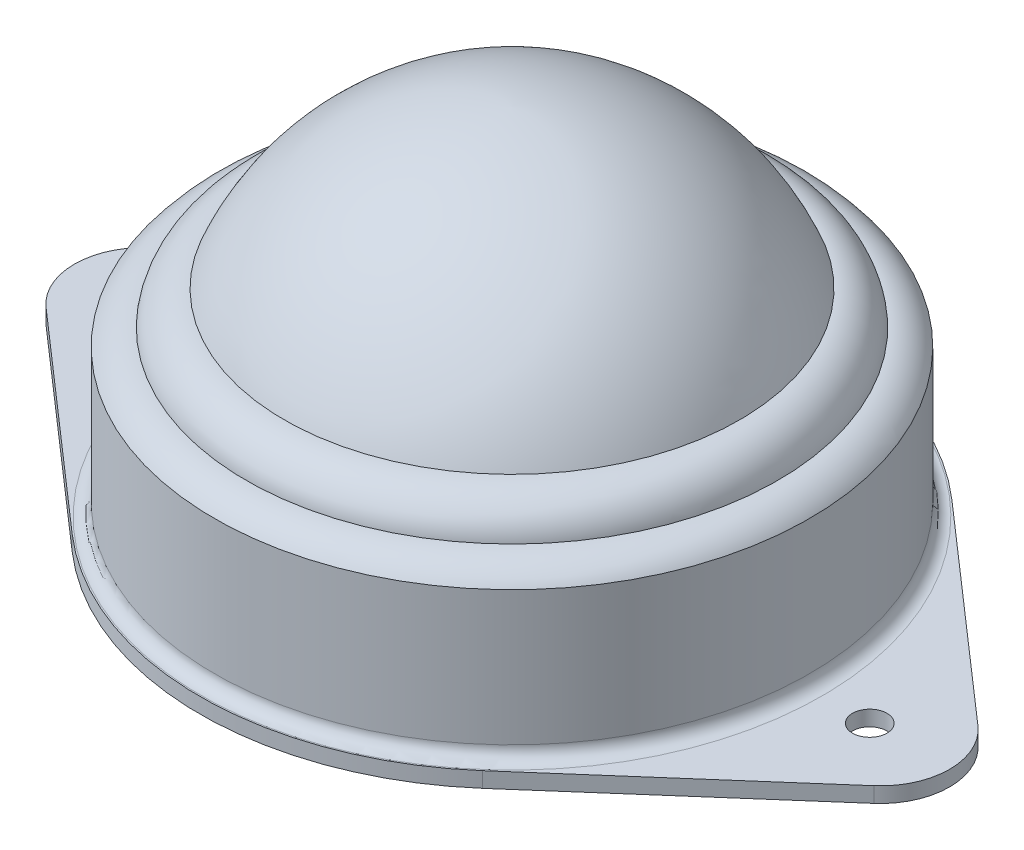
ISO-10303-21;
HEADER;
FILE_DESCRIPTION(('STEP AP214'),'2;1');
FILE_NAME('part.step','',(''),(''),'','','');
FILE_SCHEMA(('AUTOMOTIVE_DESIGN { 1 0 10303 214 1 1 1 1 }'));
ENDSEC;
DATA;
#1=APPLICATION_CONTEXT('core data for automotive mechanical design processes');
#2=APPLICATION_PROTOCOL_DEFINITION('international standard','automotive_design',2000,#1);
#3=PRODUCT_CONTEXT('',#1,'mechanical');
#4=PRODUCT('Part','Part','',(#3));
#5=PRODUCT_RELATED_PRODUCT_CATEGORY('part','',(#4));
#6=PRODUCT_DEFINITION_FORMATION('','',#4);
#7=PRODUCT_DEFINITION_CONTEXT('part definition',#1,'design');
#8=PRODUCT_DEFINITION('design','',#6,#7);
#9=PRODUCT_DEFINITION_SHAPE('','',#8);
#10=(LENGTH_UNIT() NAMED_UNIT(*) SI_UNIT(.MILLI.,.METRE.));
#11=(NAMED_UNIT(*) PLANE_ANGLE_UNIT() SI_UNIT($,.RADIAN.));
#12=(NAMED_UNIT(*) SI_UNIT($,.STERADIAN.) SOLID_ANGLE_UNIT());
#13=UNCERTAINTY_MEASURE_WITH_UNIT(LENGTH_MEASURE(1.E-05),#10,'distance_accuracy_value','');
#14=(GEOMETRIC_REPRESENTATION_CONTEXT(3) GLOBAL_UNCERTAINTY_ASSIGNED_CONTEXT((#13)) GLOBAL_UNIT_ASSIGNED_CONTEXT((#10,
#11,#12)) REPRESENTATION_CONTEXT('',''));
#15=CARTESIAN_POINT('',(0.,0.,0.));
#16=DIRECTION('',(0.,0.,1.));
#17=DIRECTION('',(1.,0.,0.));
#18=AXIS2_PLACEMENT_3D('',#15,#16,#17);
#19=CARTESIAN_POINT('',(0.,0.,0.));
#20=DIRECTION('',(0.,-1.,0.));
#21=DIRECTION('',(0.,0.,-1.));
#22=AXIS2_PLACEMENT_3D('',#19,#20,#21);
#23=CYLINDRICAL_SURFACE('',#22,23.2910581343404);
#24=CARTESIAN_POINT('',(0.,1.,0.));
#25=DIRECTION('',(0.,-1.,0.));
#26=DIRECTION('',(0.,0.,-1.));
#27=AXIS2_PLACEMENT_3D('',#24,#25,#26);
#28=CIRCLE('',#27,23.2910581343404);
#29=CARTESIAN_POINT('',(0.,1.,-23.2910581343404));
#30=VERTEX_POINT('',#29);
#31=EDGE_CURVE('E11',#30,#30,#28,.F.);
#32=ORIENTED_EDGE('',*,*,#31,.T.);
#33=EDGE_LOOP('',(#32));
#34=FACE_BOUND('',#33,.T.);
#35=CARTESIAN_POINT('',(0.,11.5188668124026,0.));
#36=DIRECTION('',(0.,-1.,0.));
#37=DIRECTION('',(0.,0.,-1.));
#38=AXIS2_PLACEMENT_3D('',#35,#36,#37);
#39=CIRCLE('',#38,23.2910581343404);
#40=CARTESIAN_POINT('',(0.,11.5188668124026,-23.2910581343404));
#41=VERTEX_POINT('',#40);
#42=EDGE_CURVE('E173',#41,#41,#39,.T.);
#43=ORIENTED_EDGE('',*,*,#42,.T.);
#44=EDGE_LOOP('',(#43));
#45=FACE_BOUND('',#44,.T.);
#46=ADVANCED_FACE('F35',(#34,#45),#23,.T.);
#47=CARTESIAN_POINT('',(0.,9.8502327456351,0.));
#48=DIRECTION('',(0.,-1.,0.));
#49=DIRECTION('',(0.,0.,-1.));
#50=AXIS2_PLACEMENT_3D('',#47,#48,#49);
#51=TOROIDAL_SURFACE('',#50,20.7979355237928,3.00000000000011);
#52=CARTESIAN_POINT('',(0.,12.8502327455635,0.));
#53=DIRECTION('',(0.,-1.,0.));
#54=DIRECTION('',(0.,0.,-1.));
#55=AXIS2_PLACEMENT_3D('',#52,#53,#54);
#56=CIRCLE('',#55,20.7979147825503);
#57=CARTESIAN_POINT('',(0.,12.8502327455635,-20.7979147825503));
#58=VERTEX_POINT('',#57);
#59=EDGE_CURVE('E170',#58,#58,#56,.T.);
#60=ORIENTED_EDGE('',*,*,#59,.T.);
#61=EDGE_LOOP('',(#60));
#62=FACE_BOUND('',#61,.T.);
#63=ORIENTED_EDGE('',*,*,#42,.F.);
#64=EDGE_LOOP('',(#63));
#65=FACE_BOUND('',#64,.T.);
#66=ADVANCED_FACE('F192',(#62,#65),#51,.T.);
#67=CARTESIAN_POINT('',(0.,12.4686936550449,0.));
#68=DIRECTION('',(0.,-1.,0.));
#69=DIRECTION('',(0.,0.,-1.));
#70=AXIS2_PLACEMENT_3D('',#67,#68,#69);
#71=TOROIDAL_SURFACE('',#70,17.8222757045694,3.0000000000001);
#72=CARTESIAN_POINT('',(0.,15.4686936510302,0.));
#73=DIRECTION('',(0.,-1.,0.));
#74=DIRECTION('',(0.,0.,-1.));
#75=AXIS2_PLACEMENT_3D('',#72,#73,#74);
#76=CIRCLE('',#75,17.8221204992835);
#77=CARTESIAN_POINT('',(0.,15.4686936510302,-17.8221204992835));
#78=VERTEX_POINT('',#77);
#79=EDGE_CURVE('E167',#78,#78,#76,.T.);
#80=ORIENTED_EDGE('',*,*,#79,.T.);
#81=EDGE_LOOP('',(#80));
#82=FACE_BOUND('',#81,.T.);
#83=ORIENTED_EDGE('',*,*,#59,.F.);
#84=EDGE_LOOP('',(#83));
#85=FACE_BOUND('',#84,.T.);
#86=ADVANCED_FACE('F197',(#82,#85),#71,.T.);
#87=CARTESIAN_POINT('',(0.,7.93752103420176,0.56591275410103));
#88=DIRECTION('',(-1.,0.,0.));
#89=DIRECTION('',(0.,0.,-1.));
#90=AXIS2_PLACEMENT_3D('',#87,#88,#89);
#91=CIRCLE('',#90,19.8705391953022);
#92=TRIMMED_CURVE('',#91,(PARAMETER_VALUE(-1.5423124854973)),(PARAMETER_VALUE(1.5423124854973)),
.T.,.PARAMETER.);
#93=CARTESIAN_POINT('',(0.,7.93752103420176,0.));
#94=DIRECTION('',(0.,-1.,0.));
#95=AXIS1_PLACEMENT('',#93,#94);
#96=SURFACE_OF_REVOLUTION('',#92,#95);
#97=CARTESIAN_POINT('',(0.,27.8000000000003,0.));
#98=VERTEX_POINT('',#97);
#99=VERTEX_LOOP('',#98);
#100=FACE_BOUND('',#99,.T.);
#101=ORIENTED_EDGE('',*,*,#79,.F.);
#102=EDGE_LOOP('',(#101));
#103=FACE_BOUND('',#102,.T.);
#104=ADVANCED_FACE('F204',(#100,#103),#96,.T.);
#105=CARTESIAN_POINT('',(0.,-1.2,0.));
#106=DIRECTION('',(0.,1.,0.));
#107=DIRECTION('',(0.,0.,1.));
#108=AXIS2_PLACEMENT_3D('',#105,#106,#107);
#109=CYLINDRICAL_SURFACE('',#108,24.4);
#110=CARTESIAN_POINT('',(0.,0.,0.));
#111=DIRECTION('',(0.,-1.,0.));
#112=DIRECTION('',(0.,0.,-1.));
#113=AXIS2_PLACEMENT_3D('',#110,#111,#112);
#114=CIRCLE('',#113,24.4);
#115=CARTESIAN_POINT('',(16.0693240901213,0.,18.3612859921806));
#116=VERTEX_POINT('',#115);
#117=CARTESIAN_POINT('',(-16.0693240901213,0.,18.3612859921806));
#118=VERTEX_POINT('',#117);
#119=EDGE_CURVE('E136',#116,#118,#114,.T.);
#120=ORIENTED_EDGE('',*,*,#119,.T.);
#121=DIRECTION('',(0.,1.,0.));
#122=VECTOR('',#121,1.);
#123=CARTESIAN_POINT('',(-16.0693240901213,-1.2,18.3612859921806));
#124=LINE('',#123,#122);
#125=CARTESIAN_POINT('',(-16.0693240901213,-1.2,18.3612859921806));
#126=VERTEX_POINT('',#125);
#127=EDGE_CURVE('E165',#126,#118,#124,.T.);
#128=ORIENTED_EDGE('',*,*,#127,.F.);
#129=CARTESIAN_POINT('',(0.,-1.2,0.));
#130=DIRECTION('',(0.,-1.,0.));
#131=DIRECTION('',(0.,0.,-1.));
#132=AXIS2_PLACEMENT_3D('',#129,#130,#131);
#133=CIRCLE('',#132,24.4);
#134=CARTESIAN_POINT('',(16.0693240901213,-1.2,18.3612859921806));
#135=VERTEX_POINT('',#134);
#136=EDGE_CURVE('E152',#135,#126,#133,.T.);
#137=ORIENTED_EDGE('',*,*,#136,.F.);
#138=DIRECTION('',(0.,1.,0.));
#139=VECTOR('',#138,1.);
#140=CARTESIAN_POINT('',(16.0693240901213,-1.2,18.3612859921806));
#141=LINE('',#140,#139);
#142=EDGE_CURVE('E132',#135,#116,#141,.T.);
#143=ORIENTED_EDGE('',*,*,#142,.T.);
#144=EDGE_LOOP('',(#120,#128,#137,#143));
#145=FACE_BOUND('',#144,.T.);
#146=ADVANCED_FACE('F208',(#145),#109,.T.);
#147=CARTESIAN_POINT('',(-16.0693240901213,-1.2,18.3612859921806));
#148=DIRECTION('',(0.658578856152513,0.,-0.752511720991007));
#149=DIRECTION('',(-0.752511720991007,0.,-0.658578856152513));
#150=AXIS2_PLACEMENT_3D('',#147,#148,#149);
#151=PLANE('',#150);
#152=DIRECTION('',(-0.752511720991007,0.,-0.658578856152513));
#153=VECTOR('',#152,1.);
#154=CARTESIAN_POINT('',(-16.0693240901213,0.,18.3612859921806));
#155=LINE('',#154,#153);
#156=CARTESIAN_POINT('',(-32.4063258232236,0.,4.06356329335144));
#157=VERTEX_POINT('',#156);
#158=EDGE_CURVE('E139',#118,#157,#155,.T.);
#159=ORIENTED_EDGE('',*,*,#158,.T.);
#160=DIRECTION('',(0.,1.,0.));
#161=VECTOR('',#160,1.);
#162=CARTESIAN_POINT('',(-32.4063258232236,-1.2,4.06356329335144));
#163=LINE('',#162,#161);
#164=CARTESIAN_POINT('',(-32.4063258232236,-1.2,4.06356329335144));
#165=VERTEX_POINT('',#164);
#166=EDGE_CURVE('E162',#165,#157,#163,.T.);
#167=ORIENTED_EDGE('',*,*,#166,.F.);
#168=DIRECTION('',(-0.752511720991007,0.,-0.658578856152513));
#169=VECTOR('',#168,1.);
#170=CARTESIAN_POINT('',(-16.0693240901213,-1.2,18.3612859921806));
#171=LINE('',#170,#169);
#172=EDGE_CURVE('E95',#126,#165,#171,.T.);
#173=ORIENTED_EDGE('',*,*,#172,.F.);
#174=ORIENTED_EDGE('',*,*,#127,.T.);
#175=EDGE_LOOP('',(#159,#167,#173,#174));
#176=FACE_BOUND('',#175,.T.);
#177=ADVANCED_FACE('F211',(#176),#151,.F.);
#178=CARTESIAN_POINT('',(-28.85,-1.2,0.));
#179=DIRECTION('',(0.,1.,0.));
#180=DIRECTION('',(0.,0.,1.));
#181=AXIS2_PLACEMENT_3D('',#178,#179,#180);
#182=CYLINDRICAL_SURFACE('',#181,5.4);
#183=CARTESIAN_POINT('',(-28.85,0.,0.));
#184=DIRECTION('',(0.,-1.,0.));
#185=DIRECTION('',(0.,0.,1.));
#186=AXIS2_PLACEMENT_3D('',#183,#184,#185);
#187=CIRCLE('',#186,5.4);
#188=CARTESIAN_POINT('',(-32.4063258232236,0.,-4.06356329335144));
#189=VERTEX_POINT('',#188);
#190=EDGE_CURVE('E142',#157,#189,#187,.T.);
#191=ORIENTED_EDGE('',*,*,#190,.T.);
#192=DIRECTION('',(0.,1.,0.));
#193=VECTOR('',#192,1.);
#194=CARTESIAN_POINT('',(-32.4063258232236,-1.2,-4.06356329335144));
#195=LINE('',#194,#193);
#196=CARTESIAN_POINT('',(-32.4063258232236,-1.2,-4.06356329335144));
#197=VERTEX_POINT('',#196);
#198=EDGE_CURVE('E159',#197,#189,#195,.T.);
#199=ORIENTED_EDGE('',*,*,#198,.F.);
#200=CARTESIAN_POINT('',(-28.85,-1.2,0.));
#201=DIRECTION('',(0.,-1.,0.));
#202=DIRECTION('',(0.,0.,1.));
#203=AXIS2_PLACEMENT_3D('',#200,#201,#202);
#204=CIRCLE('',#203,5.4);
#205=EDGE_CURVE('E260',#165,#197,#204,.T.);
#206=ORIENTED_EDGE('',*,*,#205,.F.);
#207=ORIENTED_EDGE('',*,*,#166,.T.);
#208=EDGE_LOOP('',(#191,#199,#206,#207));
#209=FACE_BOUND('',#208,.T.);
#210=ADVANCED_FACE('F215',(#209),#182,.T.);
#211=CARTESIAN_POINT('',(-16.0693240901213,-1.2,-18.3612859921806));
#212=DIRECTION('',(0.658578856152513,0.,0.752511720991007));
#213=DIRECTION('',(0.752511720991007,0.,-0.658578856152513));
#214=AXIS2_PLACEMENT_3D('',#211,#212,#213);
#215=PLANE('',#214);
#216=DIRECTION('',(0.752511720991007,0.,-0.658578856152513));
#217=VECTOR('',#216,1.);
#218=CARTESIAN_POINT('',(-16.0693240901213,0.,-18.3612859921806));
#219=LINE('',#218,#217);
#220=CARTESIAN_POINT('',(-16.0693240901213,0.,-18.3612859921806));
#221=VERTEX_POINT('',#220);
#222=EDGE_CURVE('E144',#189,#221,#219,.T.);
#223=ORIENTED_EDGE('',*,*,#222,.T.);
#224=DIRECTION('',(0.,1.,0.));
#225=VECTOR('',#224,1.);
#226=CARTESIAN_POINT('',(-16.0693240901213,-1.2,-18.3612859921806));
#227=LINE('',#226,#225);
#228=CARTESIAN_POINT('',(-16.0693240901213,-1.2,-18.3612859921806));
#229=VERTEX_POINT('',#228);
#230=EDGE_CURVE('E156',#229,#221,#227,.T.);
#231=ORIENTED_EDGE('',*,*,#230,.F.);
#232=DIRECTION('',(0.752511720991007,0.,-0.658578856152513));
#233=VECTOR('',#232,1.);
#234=CARTESIAN_POINT('',(-16.0693240901213,-1.2,-18.3612859921806));
#235=LINE('',#234,#233);
#236=EDGE_CURVE('E262',#197,#229,#235,.T.);
#237=ORIENTED_EDGE('',*,*,#236,.F.);
#238=ORIENTED_EDGE('',*,*,#198,.T.);
#239=EDGE_LOOP('',(#223,#231,#237,#238));
#240=FACE_BOUND('',#239,.T.);
#241=ADVANCED_FACE('F218',(#240),#215,.F.);
#242=CARTESIAN_POINT('',(0.,-1.2,0.));
#243=DIRECTION('',(0.,1.,0.));
#244=DIRECTION('',(0.,0.,1.));
#245=AXIS2_PLACEMENT_3D('',#242,#243,#244);
#246=CYLINDRICAL_SURFACE('',#245,24.4);
#247=CARTESIAN_POINT('',(0.,0.,0.));
#248=DIRECTION('',(0.,-1.,0.));
#249=DIRECTION('',(0.,0.,-1.));
#250=AXIS2_PLACEMENT_3D('',#247,#248,#249);
#251=CIRCLE('',#250,24.4);
#252=CARTESIAN_POINT('',(16.0693240901213,0.,-18.3612859921806));
#253=VERTEX_POINT('',#252);
#254=EDGE_CURVE('E146',#221,#253,#251,.T.);
#255=ORIENTED_EDGE('',*,*,#254,.T.);
#256=DIRECTION('',(0.,1.,0.));
#257=VECTOR('',#256,1.);
#258=CARTESIAN_POINT('',(16.0693240901213,-1.2,-18.3612859921806));
#259=LINE('',#258,#257);
#260=CARTESIAN_POINT('',(16.0693240901213,-1.2,-18.3612859921806));
#261=VERTEX_POINT('',#260);
#262=EDGE_CURVE('E127',#261,#253,#259,.T.);
#263=ORIENTED_EDGE('',*,*,#262,.F.);
#264=CARTESIAN_POINT('',(0.,-1.2,0.));
#265=DIRECTION('',(0.,-1.,0.));
#266=DIRECTION('',(0.,0.,-1.));
#267=AXIS2_PLACEMENT_3D('',#264,#265,#266);
#268=CIRCLE('',#267,24.4);
#269=EDGE_CURVE('E115',#229,#261,#268,.T.);
#270=ORIENTED_EDGE('',*,*,#269,.F.);
#271=ORIENTED_EDGE('',*,*,#230,.T.);
#272=EDGE_LOOP('',(#255,#263,#270,#271));
#273=FACE_BOUND('',#272,.T.);
#274=ADVANCED_FACE('F222',(#273),#246,.T.);
#275=CARTESIAN_POINT('',(16.0693240901213,-1.2,-18.3612859921806));
#276=DIRECTION('',(-0.658578856152513,0.,0.752511720991007));
#277=DIRECTION('',(0.752511720991007,0.,0.658578856152513));
#278=AXIS2_PLACEMENT_3D('',#275,#276,#277);
#279=PLANE('',#278);
#280=DIRECTION('',(0.752511720991007,0.,0.658578856152513));
#281=VECTOR('',#280,1.);
#282=CARTESIAN_POINT('',(16.0693240901213,0.,-18.3612859921806));
#283=LINE('',#282,#281);
#284=CARTESIAN_POINT('',(32.4063258232236,0.,-4.06356329335144));
#285=VERTEX_POINT('',#284);
#286=EDGE_CURVE('E124',#253,#285,#283,.T.);
#287=ORIENTED_EDGE('',*,*,#286,.T.);
#288=DIRECTION('',(0.,1.,0.));
#289=VECTOR('',#288,1.);
#290=CARTESIAN_POINT('',(32.4063258232236,-1.2,-4.06356329335144));
#291=LINE('',#290,#289);
#292=CARTESIAN_POINT('',(32.4063258232236,-1.2,-4.06356329335144));
#293=VERTEX_POINT('',#292);
#294=EDGE_CURVE('E121',#293,#285,#291,.T.);
#295=ORIENTED_EDGE('',*,*,#294,.F.);
#296=DIRECTION('',(0.752511720991007,0.,0.658578856152513));
#297=VECTOR('',#296,1.);
#298=CARTESIAN_POINT('',(16.0693240901213,-1.2,-18.3612859921806));
#299=LINE('',#298,#297);
#300=EDGE_CURVE('E108',#261,#293,#299,.T.);
#301=ORIENTED_EDGE('',*,*,#300,.F.);
#302=ORIENTED_EDGE('',*,*,#262,.T.);
#303=EDGE_LOOP('',(#287,#295,#301,#302));
#304=FACE_BOUND('',#303,.T.);
#305=ADVANCED_FACE('F122',(#304),#279,.F.);
#306=CARTESIAN_POINT('',(28.85,-1.2,0.));
#307=DIRECTION('',(0.,1.,0.));
#308=DIRECTION('',(0.,0.,1.));
#309=AXIS2_PLACEMENT_3D('',#306,#307,#308);
#310=CYLINDRICAL_SURFACE('',#309,5.4);
#311=CARTESIAN_POINT('',(28.85,0.,0.));
#312=DIRECTION('',(0.,-1.,0.));
#313=DIRECTION('',(0.,0.,-1.));
#314=AXIS2_PLACEMENT_3D('',#311,#312,#313);
#315=CIRCLE('',#314,5.4);
#316=CARTESIAN_POINT('',(32.4063258232236,0.,4.06356329335144));
#317=VERTEX_POINT('',#316);
#318=EDGE_CURVE('E149',#285,#317,#315,.T.);
#319=ORIENTED_EDGE('',*,*,#318,.T.);
#320=DIRECTION('',(0.,1.,0.));
#321=VECTOR('',#320,1.);
#322=CARTESIAN_POINT('',(32.4063258232236,-1.2,4.06356329335144));
#323=LINE('',#322,#321);
#324=CARTESIAN_POINT('',(32.4063258232236,-1.2,4.06356329335144));
#325=VERTEX_POINT('',#324);
#326=EDGE_CURVE('E128',#325,#317,#323,.T.);
#327=ORIENTED_EDGE('',*,*,#326,.F.);
#328=CARTESIAN_POINT('',(28.85,-1.2,0.));
#329=DIRECTION('',(0.,-1.,0.));
#330=DIRECTION('',(0.,0.,-1.));
#331=AXIS2_PLACEMENT_3D('',#328,#329,#330);
#332=CIRCLE('',#331,5.4);
#333=EDGE_CURVE('E112',#293,#325,#332,.T.);
#334=ORIENTED_EDGE('',*,*,#333,.F.);
#335=ORIENTED_EDGE('',*,*,#294,.T.);
#336=EDGE_LOOP('',(#319,#327,#334,#335));
#337=FACE_BOUND('',#336,.T.);
#338=ADVANCED_FACE('F130',(#337),#310,.T.);
#339=CARTESIAN_POINT('',(16.0693240901213,-1.2,18.3612859921806));
#340=DIRECTION('',(-0.658578856152513,0.,-0.752511720991007));
#341=DIRECTION('',(-0.752511720991007,0.,0.658578856152513));
#342=AXIS2_PLACEMENT_3D('',#339,#340,#341);
#343=PLANE('',#342);
#344=DIRECTION('',(-0.752511720991007,0.,0.658578856152513));
#345=VECTOR('',#344,1.);
#346=CARTESIAN_POINT('',(16.0693240901213,0.,18.3612859921806));
#347=LINE('',#346,#345);
#348=EDGE_CURVE('E86',#317,#116,#347,.T.);
#349=ORIENTED_EDGE('',*,*,#348,.T.);
#350=ORIENTED_EDGE('',*,*,#142,.F.);
#351=DIRECTION('',(-0.752511720991007,0.,0.658578856152513));
#352=VECTOR('',#351,1.);
#353=CARTESIAN_POINT('',(16.0693240901213,-1.2,18.3612859921806));
#354=LINE('',#353,#352);
#355=EDGE_CURVE('E54',#325,#135,#354,.T.);
#356=ORIENTED_EDGE('',*,*,#355,.F.);
#357=ORIENTED_EDGE('',*,*,#326,.T.);
#358=EDGE_LOOP('',(#349,#350,#356,#357));
#359=FACE_BOUND('',#358,.T.);
#360=ADVANCED_FACE('F231',(#359),#343,.F.);
#361=CARTESIAN_POINT('',(0.,-1.2,0.));
#362=DIRECTION('',(0.,-1.,0.));
#363=DIRECTION('',(0.,0.,-1.));
#364=AXIS2_PLACEMENT_3D('',#361,#362,#363);
#365=PLANE('',#364);
#366=CARTESIAN_POINT('',(28.,-1.2,0.));
#367=DIRECTION('',(0.,1.,0.));
#368=DIRECTION('',(0.,0.,-1.));
#369=AXIS2_PLACEMENT_3D('',#366,#367,#368);
#370=CIRCLE('',#369,1.35);
#371=CARTESIAN_POINT('',(28.,-1.2,-1.35));
#372=VERTEX_POINT('',#371);
#373=EDGE_CURVE('E250',#372,#372,#370,.T.);
#374=ORIENTED_EDGE('',*,*,#373,.T.);
#375=EDGE_LOOP('',(#374));
#376=FACE_BOUND('',#375,.T.);
#377=CARTESIAN_POINT('',(-28.,-1.2,0.));
#378=DIRECTION('',(0.,1.,0.));
#379=DIRECTION('',(0.,0.,1.));
#380=AXIS2_PLACEMENT_3D('',#377,#378,#379);
#381=CIRCLE('',#380,1.35);
#382=CARTESIAN_POINT('',(-28.,-1.2,1.35));
#383=VERTEX_POINT('',#382);
#384=EDGE_CURVE('E140',#383,#383,#381,.T.);
#385=ORIENTED_EDGE('',*,*,#384,.T.);
#386=EDGE_LOOP('',(#385));
#387=FACE_BOUND('',#386,.T.);
#388=ORIENTED_EDGE('',*,*,#136,.T.);
#389=ORIENTED_EDGE('',*,*,#172,.T.);
#390=ORIENTED_EDGE('',*,*,#205,.T.);
#391=ORIENTED_EDGE('',*,*,#236,.T.);
#392=ORIENTED_EDGE('',*,*,#269,.T.);
#393=ORIENTED_EDGE('',*,*,#300,.T.);
#394=ORIENTED_EDGE('',*,*,#333,.T.);
#395=ORIENTED_EDGE('',*,*,#355,.T.);
#396=EDGE_LOOP('',(#388,#389,#390,#391,#392,#393,#394,#395));
#397=FACE_BOUND('',#396,.T.);
#398=ADVANCED_FACE('F110',(#376,#387,#397),#365,.T.);
#399=CARTESIAN_POINT('',(0.,0.,0.));
#400=DIRECTION('',(0.,-1.,0.));
#401=DIRECTION('',(0.,0.,-1.));
#402=AXIS2_PLACEMENT_3D('',#399,#400,#401);
#403=PLANE('',#402);
#404=CARTESIAN_POINT('',(0.,0.,0.));
#405=DIRECTION('',(0.,-1.,0.));
#406=DIRECTION('',(0.,0.,-1.));
#407=AXIS2_PLACEMENT_3D('',#404,#405,#406);
#408=CIRCLE('',#407,24.2910581343404);
#409=CARTESIAN_POINT('',(0.,0.,-24.2910581343404));
#410=VERTEX_POINT('',#409);
#411=EDGE_CURVE('E43',#410,#410,#408,.T.);
#412=ORIENTED_EDGE('',*,*,#411,.T.);
#413=EDGE_LOOP('',(#412));
#414=FACE_BOUND('',#413,.T.);
#415=CARTESIAN_POINT('',(28.,0.,0.));
#416=DIRECTION('',(0.,1.,0.));
#417=DIRECTION('',(0.,0.,-1.));
#418=AXIS2_PLACEMENT_3D('',#415,#416,#417);
#419=CIRCLE('',#418,1.35);
#420=CARTESIAN_POINT('',(28.,0.,-1.35));
#421=VERTEX_POINT('',#420);
#422=EDGE_CURVE('E254',#421,#421,#419,.T.);
#423=ORIENTED_EDGE('',*,*,#422,.F.);
#424=EDGE_LOOP('',(#423));
#425=FACE_BOUND('',#424,.T.);
#426=CARTESIAN_POINT('',(-28.,0.,0.));
#427=DIRECTION('',(0.,1.,0.));
#428=DIRECTION('',(0.,0.,1.));
#429=AXIS2_PLACEMENT_3D('',#426,#427,#428);
#430=CIRCLE('',#429,1.35);
#431=CARTESIAN_POINT('',(-28.,0.,1.35));
#432=VERTEX_POINT('',#431);
#433=EDGE_CURVE('E248',#432,#432,#430,.T.);
#434=ORIENTED_EDGE('',*,*,#433,.F.);
#435=EDGE_LOOP('',(#434));
#436=FACE_BOUND('',#435,.T.);
#437=ORIENTED_EDGE('',*,*,#119,.F.);
#438=ORIENTED_EDGE('',*,*,#348,.F.);
#439=ORIENTED_EDGE('',*,*,#318,.F.);
#440=ORIENTED_EDGE('',*,*,#286,.F.);
#441=ORIENTED_EDGE('',*,*,#254,.F.);
#442=ORIENTED_EDGE('',*,*,#222,.F.);
#443=ORIENTED_EDGE('',*,*,#190,.F.);
#444=ORIENTED_EDGE('',*,*,#158,.F.);
#445=EDGE_LOOP('',(#437,#438,#439,#440,#441,#442,#443,#444));
#446=FACE_BOUND('',#445,.T.);
#447=ADVANCED_FACE('F178',(#414,#425,#436,#446),#403,.F.);
#448=CARTESIAN_POINT('',(-28.,-1.2,0.));
#449=DIRECTION('',(0.,1.,0.));
#450=DIRECTION('',(0.,0.,1.));
#451=AXIS2_PLACEMENT_3D('',#448,#449,#450);
#452=CYLINDRICAL_SURFACE('',#451,1.35);
#453=ORIENTED_EDGE('',*,*,#384,.F.);
#454=EDGE_LOOP('',(#453));
#455=FACE_BOUND('',#454,.T.);
#456=ORIENTED_EDGE('',*,*,#433,.T.);
#457=EDGE_LOOP('',(#456));
#458=FACE_BOUND('',#457,.T.);
#459=ADVANCED_FACE('F187',(#455,#458),#452,.F.);
#460=CARTESIAN_POINT('',(28.,-1.2,0.));
#461=DIRECTION('',(0.,1.,0.));
#462=DIRECTION('',(0.,0.,1.));
#463=AXIS2_PLACEMENT_3D('',#460,#461,#462);
#464=CYLINDRICAL_SURFACE('',#463,1.35);
#465=ORIENTED_EDGE('',*,*,#373,.F.);
#466=EDGE_LOOP('',(#465));
#467=FACE_BOUND('',#466,.T.);
#468=ORIENTED_EDGE('',*,*,#422,.T.);
#469=EDGE_LOOP('',(#468));
#470=FACE_BOUND('',#469,.T.);
#471=ADVANCED_FACE('F182',(#467,#470),#464,.F.);
#472=CARTESIAN_POINT('',(0.,1.,0.));
#473=DIRECTION('',(0.,-1.,0.));
#474=DIRECTION('',(0.,0.,-1.));
#475=AXIS2_PLACEMENT_3D('',#472,#473,#474);
#476=TOROIDAL_SURFACE('',#475,24.2910581343404,1.);
#477=ORIENTED_EDGE('',*,*,#31,.F.);
#478=EDGE_LOOP('',(#477));
#479=FACE_BOUND('',#478,.T.);
#480=ORIENTED_EDGE('',*,*,#411,.F.);
#481=EDGE_LOOP('',(#480));
#482=FACE_BOUND('',#481,.T.);
#483=ADVANCED_FACE('F37',(#479,#482),#476,.F.);
#484=CLOSED_SHELL('',(#46,#66,#86,#104,#146,#177,#210,#241,#274,#305,#338,#360,#398,#447,#459,
#471,#483));
#485=MANIFOLD_SOLID_BREP('B2',#484);
#486=ADVANCED_BREP_SHAPE_REPRESENTATION('',(#18,#485),#14);
#487=SHAPE_DEFINITION_REPRESENTATION(#9,#486);
ENDSEC;
END-ISO-10303-21;
